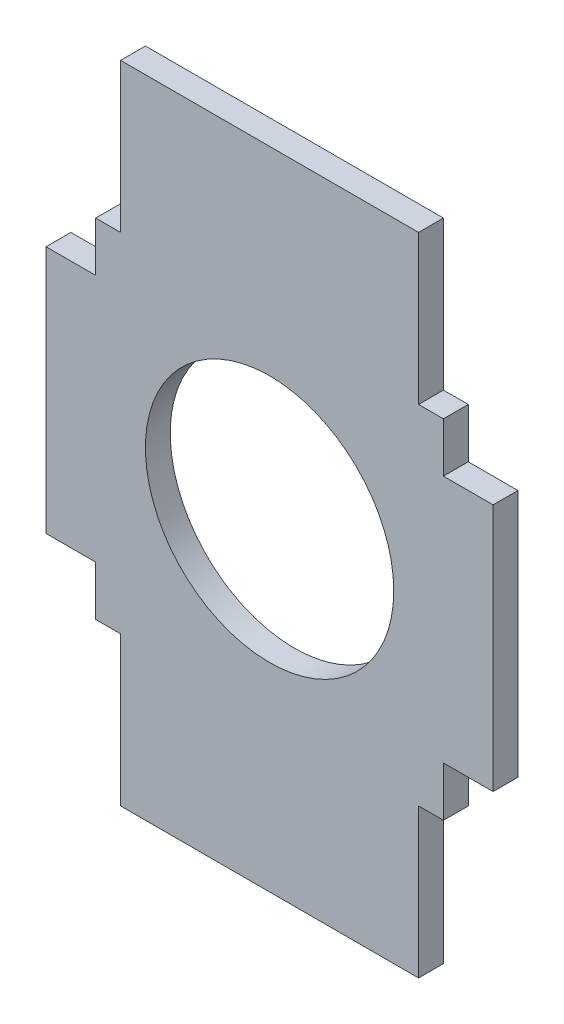
ISO-10303-21;
HEADER;
FILE_DESCRIPTION(('STEP AP214'),'2;1');
FILE_NAME('part.step','',(''),(''),'','','');
FILE_SCHEMA(('AUTOMOTIVE_DESIGN { 1 0 10303 214 1 1 1 1 }'));
ENDSEC;
DATA;
#1=APPLICATION_CONTEXT('core data for automotive mechanical design processes');
#2=APPLICATION_PROTOCOL_DEFINITION('international standard','automotive_design',2000,#1);
#3=PRODUCT_CONTEXT('',#1,'mechanical');
#4=PRODUCT('Part','Part','',(#3));
#5=PRODUCT_RELATED_PRODUCT_CATEGORY('part','',(#4));
#6=PRODUCT_DEFINITION_FORMATION('','',#4);
#7=PRODUCT_DEFINITION_CONTEXT('part definition',#1,'design');
#8=PRODUCT_DEFINITION('design','',#6,#7);
#9=PRODUCT_DEFINITION_SHAPE('','',#8);
#10=(LENGTH_UNIT() NAMED_UNIT(*) SI_UNIT(.MILLI.,.METRE.));
#11=(NAMED_UNIT(*) PLANE_ANGLE_UNIT() SI_UNIT($,.RADIAN.));
#12=(NAMED_UNIT(*) SI_UNIT($,.STERADIAN.) SOLID_ANGLE_UNIT());
#13=UNCERTAINTY_MEASURE_WITH_UNIT(LENGTH_MEASURE(1.E-05),#10,'distance_accuracy_value','');
#14=(GEOMETRIC_REPRESENTATION_CONTEXT(3) GLOBAL_UNCERTAINTY_ASSIGNED_CONTEXT((#13)) GLOBAL_UNIT_ASSIGNED_CONTEXT((#10,
#11,#12)) REPRESENTATION_CONTEXT('',''));
#15=CARTESIAN_POINT('',(0.,0.,0.));
#16=DIRECTION('',(0.,0.,1.));
#17=DIRECTION('',(1.,0.,0.));
#18=AXIS2_PLACEMENT_3D('',#15,#16,#17);
#19=CARTESIAN_POINT('',(-3.73351545858061,352.57227708954,-3.175));
#20=DIRECTION('',(-1.,0.,0.));
#21=DIRECTION('',(0.,0.,1.));
#22=AXIS2_PLACEMENT_3D('',#19,#20,#21);
#23=PLANE('',#22);
#24=DIRECTION('',(0.,-1.,0.));
#25=VECTOR('',#24,1.);
#26=CARTESIAN_POINT('',(-3.73351545858061,352.57227708954,0.));
#27=LINE('',#26,#25);
#28=CARTESIAN_POINT('',(-3.73351545858061,352.57227708954,0.));
#29=VERTEX_POINT('',#28);
#30=CARTESIAN_POINT('',(-3.73351545858061,346.22227708954,0.));
#31=VERTEX_POINT('',#30);
#32=EDGE_CURVE('E202',#29,#31,#27,.T.);
#33=ORIENTED_EDGE('',*,*,#32,.F.);
#34=DIRECTION('',(0.,0.,1.));
#35=VECTOR('',#34,1.);
#36=CARTESIAN_POINT('',(-3.73351545858061,352.57227708954,-3.175));
#37=LINE('',#36,#35);
#38=CARTESIAN_POINT('',(-3.73351545858061,352.57227708954,-3.175));
#39=VERTEX_POINT('',#38);
#40=EDGE_CURVE('E11',#39,#29,#37,.T.);
#41=ORIENTED_EDGE('',*,*,#40,.F.);
#42=DIRECTION('',(0.,-1.,0.));
#43=VECTOR('',#42,1.);
#44=CARTESIAN_POINT('',(-3.73351545858061,352.57227708954,-3.175));
#45=LINE('',#44,#43);
#46=CARTESIAN_POINT('',(-3.73351545858061,346.22227708954,-3.175));
#47=VERTEX_POINT('',#46);
#48=EDGE_CURVE('E259',#39,#47,#45,.T.);
#49=ORIENTED_EDGE('',*,*,#48,.T.);
#50=DIRECTION('',(0.,0.,1.));
#51=VECTOR('',#50,1.);
#52=CARTESIAN_POINT('',(-3.73351545858061,346.22227708954,-3.175));
#53=LINE('',#52,#51);
#54=EDGE_CURVE('E36',#47,#31,#53,.T.);
#55=ORIENTED_EDGE('',*,*,#54,.T.);
#56=EDGE_LOOP('',(#33,#41,#49,#55));
#57=FACE_BOUND('',#56,.T.);
#58=ADVANCED_FACE('F33',(#57),#23,.T.);
#59=CARTESIAN_POINT('',(-0.558515457864788,352.57227708954,-3.175));
#60=DIRECTION('',(0.,1.,0.));
#61=DIRECTION('',(0.,0.,1.));
#62=AXIS2_PLACEMENT_3D('',#59,#60,#61);
#63=PLANE('',#62);
#64=DIRECTION('',(-1.,0.,0.));
#65=VECTOR('',#64,1.);
#66=CARTESIAN_POINT('',(-0.558515457864788,352.57227708954,0.));
#67=LINE('',#66,#65);
#68=CARTESIAN_POINT('',(-0.558515457864788,352.57227708954,0.));
#69=VERTEX_POINT('',#68);
#70=EDGE_CURVE('E257',#69,#29,#67,.T.);
#71=ORIENTED_EDGE('',*,*,#70,.F.);
#72=DIRECTION('',(0.,0.,1.));
#73=VECTOR('',#72,1.);
#74=CARTESIAN_POINT('',(-0.558515457864788,352.57227708954,-3.175));
#75=LINE('',#74,#73);
#76=CARTESIAN_POINT('',(-0.558515457864788,352.57227708954,-3.175));
#77=VERTEX_POINT('',#76);
#78=EDGE_CURVE('E42',#77,#69,#75,.T.);
#79=ORIENTED_EDGE('',*,*,#78,.F.);
#80=DIRECTION('',(-1.,0.,0.));
#81=VECTOR('',#80,1.);
#82=CARTESIAN_POINT('',(-0.558515457864788,352.57227708954,-3.175));
#83=LINE('',#82,#81);
#84=EDGE_CURVE('E192',#77,#39,#83,.T.);
#85=ORIENTED_EDGE('',*,*,#84,.T.);
#86=ORIENTED_EDGE('',*,*,#40,.T.);
#87=EDGE_LOOP('',(#71,#79,#85,#86));
#88=FACE_BOUND('',#87,.T.);
#89=ADVANCED_FACE('F295',(#88),#63,.T.);
#90=CARTESIAN_POINT('',(-0.55851545786479,371.62227708954,-3.175));
#91=DIRECTION('',(-1.,0.,0.));
#92=DIRECTION('',(0.,-1.,0.));
#93=AXIS2_PLACEMENT_3D('',#90,#91,#92);
#94=PLANE('',#93);
#95=DIRECTION('',(0.,-1.,0.));
#96=VECTOR('',#95,1.);
#97=CARTESIAN_POINT('',(-0.55851545786479,371.62227708954,0.));
#98=LINE('',#97,#96);
#99=CARTESIAN_POINT('',(-0.55851545786479,371.62227708954,0.));
#100=VERTEX_POINT('',#99);
#101=EDGE_CURVE('E179',#100,#69,#98,.T.);
#102=ORIENTED_EDGE('',*,*,#101,.F.);
#103=DIRECTION('',(0.,0.,1.));
#104=VECTOR('',#103,1.);
#105=CARTESIAN_POINT('',(-0.55851545786479,371.62227708954,-3.175));
#106=LINE('',#105,#104);
#107=CARTESIAN_POINT('',(-0.55851545786479,371.62227708954,-3.175));
#108=VERTEX_POINT('',#107);
#109=EDGE_CURVE('E174',#108,#100,#106,.T.);
#110=ORIENTED_EDGE('',*,*,#109,.F.);
#111=DIRECTION('',(0.,-1.,0.));
#112=VECTOR('',#111,1.);
#113=CARTESIAN_POINT('',(-0.55851545786479,371.62227708954,-3.175));
#114=LINE('',#113,#112);
#115=EDGE_CURVE('E177',#108,#77,#114,.T.);
#116=ORIENTED_EDGE('',*,*,#115,.T.);
#117=ORIENTED_EDGE('',*,*,#78,.T.);
#118=EDGE_LOOP('',(#102,#110,#116,#117));
#119=FACE_BOUND('',#118,.T.);
#120=ADVANCED_FACE('F176',(#119),#94,.T.);
#121=CARTESIAN_POINT('',(-0.55851545786479,371.62227708954,-3.175));
#122=DIRECTION('',(0.,1.,0.));
#123=DIRECTION('',(0.,0.,1.));
#124=AXIS2_PLACEMENT_3D('',#121,#122,#123);
#125=PLANE('',#124);
#126=DIRECTION('',(-1.,0.,0.));
#127=VECTOR('',#126,1.);
#128=CARTESIAN_POINT('',(-0.55851545786479,371.62227708954,0.));
#129=LINE('',#128,#127);
#130=CARTESIAN_POINT('',(37.5414845421352,371.62227708954,0.));
#131=VERTEX_POINT('',#130);
#132=EDGE_CURVE('E254',#131,#100,#129,.T.);
#133=ORIENTED_EDGE('',*,*,#132,.F.);
#134=DIRECTION('',(0.,0.,1.));
#135=VECTOR('',#134,1.);
#136=CARTESIAN_POINT('',(37.5414845421352,371.62227708954,-3.175));
#137=LINE('',#136,#135);
#138=CARTESIAN_POINT('',(37.5414845421352,371.62227708954,-3.175));
#139=VERTEX_POINT('',#138);
#140=EDGE_CURVE('E184',#139,#131,#137,.T.);
#141=ORIENTED_EDGE('',*,*,#140,.F.);
#142=DIRECTION('',(-1.,0.,0.));
#143=VECTOR('',#142,1.);
#144=CARTESIAN_POINT('',(-0.55851545786479,371.62227708954,-3.175));
#145=LINE('',#144,#143);
#146=EDGE_CURVE('E190',#139,#108,#145,.T.);
#147=ORIENTED_EDGE('',*,*,#146,.T.);
#148=ORIENTED_EDGE('',*,*,#109,.T.);
#149=EDGE_LOOP('',(#133,#141,#147,#148));
#150=FACE_BOUND('',#149,.T.);
#151=ADVANCED_FACE('F194',(#150),#125,.T.);
#152=CARTESIAN_POINT('',(37.5414845421352,371.62227708954,-3.175));
#153=DIRECTION('',(1.,0.,0.));
#154=DIRECTION('',(0.,0.,-1.));
#155=AXIS2_PLACEMENT_3D('',#152,#153,#154);
#156=PLANE('',#155);
#157=DIRECTION('',(0.,1.,0.));
#158=VECTOR('',#157,1.);
#159=CARTESIAN_POINT('',(37.5414845421352,371.62227708954,0.));
#160=LINE('',#159,#158);
#161=CARTESIAN_POINT('',(37.5414845421352,352.57227708954,0.));
#162=VERTEX_POINT('',#161);
#163=EDGE_CURVE('E251',#162,#131,#160,.T.);
#164=ORIENTED_EDGE('',*,*,#163,.F.);
#165=DIRECTION('',(0.,0.,1.));
#166=VECTOR('',#165,1.);
#167=CARTESIAN_POINT('',(37.5414845421352,352.57227708954,-3.175));
#168=LINE('',#167,#166);
#169=CARTESIAN_POINT('',(37.5414845421352,352.57227708954,-3.175));
#170=VERTEX_POINT('',#169);
#171=EDGE_CURVE('E263',#170,#162,#168,.T.);
#172=ORIENTED_EDGE('',*,*,#171,.F.);
#173=DIRECTION('',(0.,1.,0.));
#174=VECTOR('',#173,1.);
#175=CARTESIAN_POINT('',(37.5414845421352,371.62227708954,-3.175));
#176=LINE('',#175,#174);
#177=EDGE_CURVE('E195',#170,#139,#176,.T.);
#178=ORIENTED_EDGE('',*,*,#177,.T.);
#179=ORIENTED_EDGE('',*,*,#140,.T.);
#180=EDGE_LOOP('',(#164,#172,#178,#179));
#181=FACE_BOUND('',#180,.T.);
#182=ADVANCED_FACE('F308',(#181),#156,.T.);
#183=CARTESIAN_POINT('',(37.5414845421352,352.57227708954,-3.175));
#184=DIRECTION('',(0.,1.,0.));
#185=DIRECTION('',(0.,0.,1.));
#186=AXIS2_PLACEMENT_3D('',#183,#184,#185);
#187=PLANE('',#186);
#188=DIRECTION('',(-1.,0.,0.));
#189=VECTOR('',#188,1.);
#190=CARTESIAN_POINT('',(37.5414845421352,352.57227708954,0.));
#191=LINE('',#190,#189);
#192=CARTESIAN_POINT('',(40.7164845407036,352.57227708954,0.));
#193=VERTEX_POINT('',#192);
#194=EDGE_CURVE('E248',#193,#162,#191,.T.);
#195=ORIENTED_EDGE('',*,*,#194,.F.);
#196=DIRECTION('',(0.,0.,1.));
#197=VECTOR('',#196,1.);
#198=CARTESIAN_POINT('',(40.7164845407036,352.57227708954,-3.175));
#199=LINE('',#198,#197);
#200=CARTESIAN_POINT('',(40.7164845407036,352.57227708954,-3.175));
#201=VERTEX_POINT('',#200);
#202=EDGE_CURVE('E265',#201,#193,#199,.T.);
#203=ORIENTED_EDGE('',*,*,#202,.F.);
#204=DIRECTION('',(-1.,0.,0.));
#205=VECTOR('',#204,1.);
#206=CARTESIAN_POINT('',(37.5414845421352,352.57227708954,-3.175));
#207=LINE('',#206,#205);
#208=EDGE_CURVE('E197',#201,#170,#207,.T.);
#209=ORIENTED_EDGE('',*,*,#208,.T.);
#210=ORIENTED_EDGE('',*,*,#171,.T.);
#211=EDGE_LOOP('',(#195,#203,#209,#210));
#212=FACE_BOUND('',#211,.T.);
#213=ADVANCED_FACE('F311',(#212),#187,.T.);
#214=CARTESIAN_POINT('',(40.7164845407036,352.57227708954,-3.175));
#215=DIRECTION('',(1.,0.,0.));
#216=DIRECTION('',(0.,0.,-1.));
#217=AXIS2_PLACEMENT_3D('',#214,#215,#216);
#218=PLANE('',#217);
#219=DIRECTION('',(0.,1.,0.));
#220=VECTOR('',#219,1.);
#221=CARTESIAN_POINT('',(40.7164845407036,352.57227708954,0.));
#222=LINE('',#221,#220);
#223=CARTESIAN_POINT('',(40.7164845407036,346.22227708954,0.));
#224=VERTEX_POINT('',#223);
#225=EDGE_CURVE('E245',#224,#193,#222,.T.);
#226=ORIENTED_EDGE('',*,*,#225,.F.);
#227=DIRECTION('',(0.,0.,1.));
#228=VECTOR('',#227,1.);
#229=CARTESIAN_POINT('',(40.7164845407036,346.22227708954,-3.175));
#230=LINE('',#229,#228);
#231=CARTESIAN_POINT('',(40.7164845407036,346.22227708954,-3.175));
#232=VERTEX_POINT('',#231);
#233=EDGE_CURVE('E267',#232,#224,#230,.T.);
#234=ORIENTED_EDGE('',*,*,#233,.F.);
#235=DIRECTION('',(0.,1.,0.));
#236=VECTOR('',#235,1.);
#237=CARTESIAN_POINT('',(40.7164845407036,352.57227708954,-3.175));
#238=LINE('',#237,#236);
#239=EDGE_CURVE('E430',#232,#201,#238,.T.);
#240=ORIENTED_EDGE('',*,*,#239,.T.);
#241=ORIENTED_EDGE('',*,*,#202,.T.);
#242=EDGE_LOOP('',(#226,#234,#240,#241));
#243=FACE_BOUND('',#242,.T.);
#244=ADVANCED_FACE('F315',(#243),#218,.T.);
#245=CARTESIAN_POINT('',(47.0664845399878,346.22227708954,-3.175));
#246=DIRECTION('',(0.,1.,0.));
#247=DIRECTION('',(0.,0.,1.));
#248=AXIS2_PLACEMENT_3D('',#245,#246,#247);
#249=PLANE('',#248);
#250=DIRECTION('',(-1.,0.,0.));
#251=VECTOR('',#250,1.);
#252=CARTESIAN_POINT('',(47.0664845399878,346.22227708954,0.));
#253=LINE('',#252,#251);
#254=CARTESIAN_POINT('',(47.0664845399878,346.22227708954,0.));
#255=VERTEX_POINT('',#254);
#256=EDGE_CURVE('E242',#255,#224,#253,.T.);
#257=ORIENTED_EDGE('',*,*,#256,.F.);
#258=DIRECTION('',(0.,0.,1.));
#259=VECTOR('',#258,1.);
#260=CARTESIAN_POINT('',(47.0664845399878,346.22227708954,-3.175));
#261=LINE('',#260,#259);
#262=CARTESIAN_POINT('',(47.0664845399878,346.22227708954,-3.175));
#263=VERTEX_POINT('',#262);
#264=EDGE_CURVE('E269',#263,#255,#261,.T.);
#265=ORIENTED_EDGE('',*,*,#264,.F.);
#266=DIRECTION('',(-1.,0.,0.));
#267=VECTOR('',#266,1.);
#268=CARTESIAN_POINT('',(47.0664845399878,346.22227708954,-3.175));
#269=LINE('',#268,#267);
#270=EDGE_CURVE('E427',#263,#232,#269,.T.);
#271=ORIENTED_EDGE('',*,*,#270,.T.);
#272=ORIENTED_EDGE('',*,*,#233,.T.);
#273=EDGE_LOOP('',(#257,#265,#271,#272));
#274=FACE_BOUND('',#273,.T.);
#275=ADVANCED_FACE('F319',(#274),#249,.T.);
#276=CARTESIAN_POINT('',(47.0664845399878,346.22227708954,-3.175));
#277=DIRECTION('',(1.,0.,0.));
#278=DIRECTION('',(0.,0.,-1.));
#279=AXIS2_PLACEMENT_3D('',#276,#277,#278);
#280=PLANE('',#279);
#281=DIRECTION('',(0.,1.,0.));
#282=VECTOR('',#281,1.);
#283=CARTESIAN_POINT('',(47.0664845399878,346.22227708954,0.));
#284=LINE('',#283,#282);
#285=CARTESIAN_POINT('',(47.0664845399878,314.47227708954,0.));
#286=VERTEX_POINT('',#285);
#287=EDGE_CURVE('E239',#286,#255,#284,.T.);
#288=ORIENTED_EDGE('',*,*,#287,.F.);
#289=DIRECTION('',(0.,0.,1.));
#290=VECTOR('',#289,1.);
#291=CARTESIAN_POINT('',(47.0664845399878,314.47227708954,-3.175));
#292=LINE('',#291,#290);
#293=CARTESIAN_POINT('',(47.0664845399878,314.47227708954,-3.175));
#294=VERTEX_POINT('',#293);
#295=EDGE_CURVE('E271',#294,#286,#292,.T.);
#296=ORIENTED_EDGE('',*,*,#295,.F.);
#297=DIRECTION('',(0.,1.,0.));
#298=VECTOR('',#297,1.);
#299=CARTESIAN_POINT('',(47.0664845399878,346.22227708954,-3.175));
#300=LINE('',#299,#298);
#301=EDGE_CURVE('E424',#294,#263,#300,.T.);
#302=ORIENTED_EDGE('',*,*,#301,.T.);
#303=ORIENTED_EDGE('',*,*,#264,.T.);
#304=EDGE_LOOP('',(#288,#296,#302,#303));
#305=FACE_BOUND('',#304,.T.);
#306=ADVANCED_FACE('F323',(#305),#280,.T.);
#307=CARTESIAN_POINT('',(47.0664845399878,314.47227708954,-3.175));
#308=DIRECTION('',(0.,-1.,0.));
#309=DIRECTION('',(0.,0.,-1.));
#310=AXIS2_PLACEMENT_3D('',#307,#308,#309);
#311=PLANE('',#310);
#312=DIRECTION('',(1.,0.,0.));
#313=VECTOR('',#312,1.);
#314=CARTESIAN_POINT('',(47.0664845399878,314.47227708954,0.));
#315=LINE('',#314,#313);
#316=CARTESIAN_POINT('',(40.7164845407036,314.47227708954,0.));
#317=VERTEX_POINT('',#316);
#318=EDGE_CURVE('E236',#317,#286,#315,.T.);
#319=ORIENTED_EDGE('',*,*,#318,.F.);
#320=DIRECTION('',(0.,0.,1.));
#321=VECTOR('',#320,1.);
#322=CARTESIAN_POINT('',(40.7164845407036,314.47227708954,-3.175));
#323=LINE('',#322,#321);
#324=CARTESIAN_POINT('',(40.7164845407036,314.47227708954,-3.175));
#325=VERTEX_POINT('',#324);
#326=EDGE_CURVE('E273',#325,#317,#323,.T.);
#327=ORIENTED_EDGE('',*,*,#326,.F.);
#328=DIRECTION('',(1.,0.,0.));
#329=VECTOR('',#328,1.);
#330=CARTESIAN_POINT('',(47.0664845399878,314.47227708954,-3.175));
#331=LINE('',#330,#329);
#332=EDGE_CURVE('E421',#325,#294,#331,.T.);
#333=ORIENTED_EDGE('',*,*,#332,.T.);
#334=ORIENTED_EDGE('',*,*,#295,.T.);
#335=EDGE_LOOP('',(#319,#327,#333,#334));
#336=FACE_BOUND('',#335,.T.);
#337=ADVANCED_FACE('F327',(#336),#311,.T.);
#338=CARTESIAN_POINT('',(40.7164845407036,308.12227708954,-3.175));
#339=DIRECTION('',(1.,0.,0.));
#340=DIRECTION('',(0.,0.,-1.));
#341=AXIS2_PLACEMENT_3D('',#338,#339,#340);
#342=PLANE('',#341);
#343=DIRECTION('',(0.,1.,0.));
#344=VECTOR('',#343,1.);
#345=CARTESIAN_POINT('',(40.7164845407036,308.12227708954,0.));
#346=LINE('',#345,#344);
#347=CARTESIAN_POINT('',(40.7164845407036,308.12227708954,0.));
#348=VERTEX_POINT('',#347);
#349=EDGE_CURVE('E233',#348,#317,#346,.T.);
#350=ORIENTED_EDGE('',*,*,#349,.F.);
#351=DIRECTION('',(0.,0.,1.));
#352=VECTOR('',#351,1.);
#353=CARTESIAN_POINT('',(40.7164845407036,308.12227708954,-3.175));
#354=LINE('',#353,#352);
#355=CARTESIAN_POINT('',(40.7164845407036,308.12227708954,-3.175));
#356=VERTEX_POINT('',#355);
#357=EDGE_CURVE('E275',#356,#348,#354,.T.);
#358=ORIENTED_EDGE('',*,*,#357,.F.);
#359=DIRECTION('',(0.,1.,0.));
#360=VECTOR('',#359,1.);
#361=CARTESIAN_POINT('',(40.7164845407036,308.12227708954,-3.175));
#362=LINE('',#361,#360);
#363=EDGE_CURVE('E418',#356,#325,#362,.T.);
#364=ORIENTED_EDGE('',*,*,#363,.T.);
#365=ORIENTED_EDGE('',*,*,#326,.T.);
#366=EDGE_LOOP('',(#350,#358,#364,#365));
#367=FACE_BOUND('',#366,.T.);
#368=ADVANCED_FACE('F331',(#367),#342,.T.);
#369=CARTESIAN_POINT('',(37.5414845421352,308.12227708954,-3.175));
#370=DIRECTION('',(0.,-1.,0.));
#371=DIRECTION('',(0.,0.,-1.));
#372=AXIS2_PLACEMENT_3D('',#369,#370,#371);
#373=PLANE('',#372);
#374=DIRECTION('',(1.,0.,0.));
#375=VECTOR('',#374,1.);
#376=CARTESIAN_POINT('',(37.5414845421352,308.12227708954,0.));
#377=LINE('',#376,#375);
#378=CARTESIAN_POINT('',(37.5414845421352,308.12227708954,0.));
#379=VERTEX_POINT('',#378);
#380=EDGE_CURVE('E230',#379,#348,#377,.T.);
#381=ORIENTED_EDGE('',*,*,#380,.F.);
#382=DIRECTION('',(0.,0.,1.));
#383=VECTOR('',#382,1.);
#384=CARTESIAN_POINT('',(37.5414845421352,308.12227708954,-3.175));
#385=LINE('',#384,#383);
#386=CARTESIAN_POINT('',(37.5414845421352,308.12227708954,-3.175));
#387=VERTEX_POINT('',#386);
#388=EDGE_CURVE('E277',#387,#379,#385,.T.);
#389=ORIENTED_EDGE('',*,*,#388,.F.);
#390=DIRECTION('',(1.,0.,0.));
#391=VECTOR('',#390,1.);
#392=CARTESIAN_POINT('',(37.5414845421352,308.12227708954,-3.175));
#393=LINE('',#392,#391);
#394=EDGE_CURVE('E415',#387,#356,#393,.T.);
#395=ORIENTED_EDGE('',*,*,#394,.T.);
#396=ORIENTED_EDGE('',*,*,#357,.T.);
#397=EDGE_LOOP('',(#381,#389,#395,#396));
#398=FACE_BOUND('',#397,.T.);
#399=ADVANCED_FACE('F335',(#398),#373,.T.);
#400=CARTESIAN_POINT('',(37.5414845421352,289.07227708954,-3.175));
#401=DIRECTION('',(1.,0.,0.));
#402=DIRECTION('',(0.,0.,-1.));
#403=AXIS2_PLACEMENT_3D('',#400,#401,#402);
#404=PLANE('',#403);
#405=DIRECTION('',(0.,1.,0.));
#406=VECTOR('',#405,1.);
#407=CARTESIAN_POINT('',(37.5414845421352,289.07227708954,0.));
#408=LINE('',#407,#406);
#409=CARTESIAN_POINT('',(37.5414845421352,289.07227708954,0.));
#410=VERTEX_POINT('',#409);
#411=EDGE_CURVE('E227',#410,#379,#408,.T.);
#412=ORIENTED_EDGE('',*,*,#411,.F.);
#413=DIRECTION('',(0.,0.,1.));
#414=VECTOR('',#413,1.);
#415=CARTESIAN_POINT('',(37.5414845421352,289.07227708954,-3.175));
#416=LINE('',#415,#414);
#417=CARTESIAN_POINT('',(37.5414845421352,289.07227708954,-3.175));
#418=VERTEX_POINT('',#417);
#419=EDGE_CURVE('E279',#418,#410,#416,.T.);
#420=ORIENTED_EDGE('',*,*,#419,.F.);
#421=DIRECTION('',(0.,1.,0.));
#422=VECTOR('',#421,1.);
#423=CARTESIAN_POINT('',(37.5414845421352,289.07227708954,-3.175));
#424=LINE('',#423,#422);
#425=EDGE_CURVE('E412',#418,#387,#424,.T.);
#426=ORIENTED_EDGE('',*,*,#425,.T.);
#427=ORIENTED_EDGE('',*,*,#388,.T.);
#428=EDGE_LOOP('',(#412,#420,#426,#427));
#429=FACE_BOUND('',#428,.T.);
#430=ADVANCED_FACE('F339',(#429),#404,.T.);
#431=CARTESIAN_POINT('',(-0.55851545786479,289.07227708954,-3.175));
#432=DIRECTION('',(0.,-1.,0.));
#433=DIRECTION('',(0.,0.,-1.));
#434=AXIS2_PLACEMENT_3D('',#431,#432,#433);
#435=PLANE('',#434);
#436=DIRECTION('',(1.,0.,0.));
#437=VECTOR('',#436,1.);
#438=CARTESIAN_POINT('',(-0.55851545786479,289.07227708954,0.));
#439=LINE('',#438,#437);
#440=CARTESIAN_POINT('',(-0.55851545786479,289.07227708954,0.));
#441=VERTEX_POINT('',#440);
#442=EDGE_CURVE('E224',#441,#410,#439,.T.);
#443=ORIENTED_EDGE('',*,*,#442,.F.);
#444=DIRECTION('',(0.,0.,1.));
#445=VECTOR('',#444,1.);
#446=CARTESIAN_POINT('',(-0.55851545786479,289.07227708954,-3.175));
#447=LINE('',#446,#445);
#448=CARTESIAN_POINT('',(-0.55851545786479,289.07227708954,-3.175));
#449=VERTEX_POINT('',#448);
#450=EDGE_CURVE('E281',#449,#441,#447,.T.);
#451=ORIENTED_EDGE('',*,*,#450,.F.);
#452=DIRECTION('',(1.,0.,0.));
#453=VECTOR('',#452,1.);
#454=CARTESIAN_POINT('',(-0.55851545786479,289.07227708954,-3.175));
#455=LINE('',#454,#453);
#456=EDGE_CURVE('E409',#449,#418,#455,.T.);
#457=ORIENTED_EDGE('',*,*,#456,.T.);
#458=ORIENTED_EDGE('',*,*,#419,.T.);
#459=EDGE_LOOP('',(#443,#451,#457,#458));
#460=FACE_BOUND('',#459,.T.);
#461=ADVANCED_FACE('F343',(#460),#435,.T.);
#462=CARTESIAN_POINT('',(-0.55851545786479,289.07227708954,-3.175));
#463=DIRECTION('',(-1.,0.,0.));
#464=DIRECTION('',(0.,-1.,0.));
#465=AXIS2_PLACEMENT_3D('',#462,#463,#464);
#466=PLANE('',#465);
#467=DIRECTION('',(0.,-1.,0.));
#468=VECTOR('',#467,1.);
#469=CARTESIAN_POINT('',(-0.55851545786479,289.07227708954,0.));
#470=LINE('',#469,#468);
#471=CARTESIAN_POINT('',(-0.55851545786478,308.12227708954,0.));
#472=VERTEX_POINT('',#471);
#473=EDGE_CURVE('E221',#472,#441,#470,.T.);
#474=ORIENTED_EDGE('',*,*,#473,.F.);
#475=DIRECTION('',(0.,0.,1.));
#476=VECTOR('',#475,1.);
#477=CARTESIAN_POINT('',(-0.55851545786478,308.12227708954,-3.175));
#478=LINE('',#477,#476);
#479=CARTESIAN_POINT('',(-0.55851545786478,308.12227708954,-3.175));
#480=VERTEX_POINT('',#479);
#481=EDGE_CURVE('E283',#480,#472,#478,.T.);
#482=ORIENTED_EDGE('',*,*,#481,.F.);
#483=DIRECTION('',(0.,-1.,0.));
#484=VECTOR('',#483,1.);
#485=CARTESIAN_POINT('',(-0.55851545786479,289.07227708954,-3.175));
#486=LINE('',#485,#484);
#487=EDGE_CURVE('E406',#480,#449,#486,.T.);
#488=ORIENTED_EDGE('',*,*,#487,.T.);
#489=ORIENTED_EDGE('',*,*,#450,.T.);
#490=EDGE_LOOP('',(#474,#482,#488,#489));
#491=FACE_BOUND('',#490,.T.);
#492=ADVANCED_FACE('F347',(#491),#466,.T.);
#493=CARTESIAN_POINT('',(-0.55851545786478,308.12227708954,-3.175));
#494=DIRECTION('',(0.,-1.,0.));
#495=DIRECTION('',(0.,0.,-1.));
#496=AXIS2_PLACEMENT_3D('',#493,#494,#495);
#497=PLANE('',#496);
#498=DIRECTION('',(1.,0.,0.));
#499=VECTOR('',#498,1.);
#500=CARTESIAN_POINT('',(-0.55851545786478,308.12227708954,0.));
#501=LINE('',#500,#499);
#502=CARTESIAN_POINT('',(-3.73351545858061,308.12227708954,0.));
#503=VERTEX_POINT('',#502);
#504=EDGE_CURVE('E218',#503,#472,#501,.T.);
#505=ORIENTED_EDGE('',*,*,#504,.F.);
#506=DIRECTION('',(0.,0.,1.));
#507=VECTOR('',#506,1.);
#508=CARTESIAN_POINT('',(-3.73351545858061,308.12227708954,-3.175));
#509=LINE('',#508,#507);
#510=CARTESIAN_POINT('',(-3.73351545858061,308.12227708954,-3.175));
#511=VERTEX_POINT('',#510);
#512=EDGE_CURVE('E285',#511,#503,#509,.T.);
#513=ORIENTED_EDGE('',*,*,#512,.F.);
#514=DIRECTION('',(1.,0.,0.));
#515=VECTOR('',#514,1.);
#516=CARTESIAN_POINT('',(-0.55851545786478,308.12227708954,-3.175));
#517=LINE('',#516,#515);
#518=EDGE_CURVE('E403',#511,#480,#517,.T.);
#519=ORIENTED_EDGE('',*,*,#518,.T.);
#520=ORIENTED_EDGE('',*,*,#481,.T.);
#521=EDGE_LOOP('',(#505,#513,#519,#520));
#522=FACE_BOUND('',#521,.T.);
#523=ADVANCED_FACE('F351',(#522),#497,.T.);
#524=CARTESIAN_POINT('',(-3.73351545858061,308.12227708954,-3.175));
#525=DIRECTION('',(-1.,0.,0.));
#526=DIRECTION('',(0.,0.,1.));
#527=AXIS2_PLACEMENT_3D('',#524,#525,#526);
#528=PLANE('',#527);
#529=DIRECTION('',(0.,-1.,0.));
#530=VECTOR('',#529,1.);
#531=CARTESIAN_POINT('',(-3.73351545858061,308.12227708954,0.));
#532=LINE('',#531,#530);
#533=CARTESIAN_POINT('',(-3.73351545858061,314.47227708954,0.));
#534=VERTEX_POINT('',#533);
#535=EDGE_CURVE('E215',#534,#503,#532,.T.);
#536=ORIENTED_EDGE('',*,*,#535,.F.);
#537=DIRECTION('',(0.,0.,1.));
#538=VECTOR('',#537,1.);
#539=CARTESIAN_POINT('',(-3.73351545858061,314.47227708954,-3.175));
#540=LINE('',#539,#538);
#541=CARTESIAN_POINT('',(-3.73351545858061,314.47227708954,-3.175));
#542=VERTEX_POINT('',#541);
#543=EDGE_CURVE('E287',#542,#534,#540,.T.);
#544=ORIENTED_EDGE('',*,*,#543,.F.);
#545=DIRECTION('',(0.,-1.,0.));
#546=VECTOR('',#545,1.);
#547=CARTESIAN_POINT('',(-3.73351545858061,308.12227708954,-3.175));
#548=LINE('',#547,#546);
#549=EDGE_CURVE('E400',#542,#511,#548,.T.);
#550=ORIENTED_EDGE('',*,*,#549,.T.);
#551=ORIENTED_EDGE('',*,*,#512,.T.);
#552=EDGE_LOOP('',(#536,#544,#550,#551));
#553=FACE_BOUND('',#552,.T.);
#554=ADVANCED_FACE('F355',(#553),#528,.T.);
#555=CARTESIAN_POINT('',(-10.0835154578648,314.47227708954,-3.175));
#556=DIRECTION('',(0.,-1.,0.));
#557=DIRECTION('',(0.,0.,-1.));
#558=AXIS2_PLACEMENT_3D('',#555,#556,#557);
#559=PLANE('',#558);
#560=DIRECTION('',(1.,0.,0.));
#561=VECTOR('',#560,1.);
#562=CARTESIAN_POINT('',(-10.0835154578648,314.47227708954,0.));
#563=LINE('',#562,#561);
#564=CARTESIAN_POINT('',(-10.0835154578648,314.47227708954,0.));
#565=VERTEX_POINT('',#564);
#566=EDGE_CURVE('E212',#565,#534,#563,.T.);
#567=ORIENTED_EDGE('',*,*,#566,.F.);
#568=DIRECTION('',(0.,0.,1.));
#569=VECTOR('',#568,1.);
#570=CARTESIAN_POINT('',(-10.0835154578648,314.47227708954,-3.175));
#571=LINE('',#570,#569);
#572=CARTESIAN_POINT('',(-10.0835154578648,314.47227708954,-3.175));
#573=VERTEX_POINT('',#572);
#574=EDGE_CURVE('E289',#573,#565,#571,.T.);
#575=ORIENTED_EDGE('',*,*,#574,.F.);
#576=DIRECTION('',(1.,0.,0.));
#577=VECTOR('',#576,1.);
#578=CARTESIAN_POINT('',(-10.0835154578648,314.47227708954,-3.175));
#579=LINE('',#578,#577);
#580=EDGE_CURVE('E397',#573,#542,#579,.T.);
#581=ORIENTED_EDGE('',*,*,#580,.T.);
#582=ORIENTED_EDGE('',*,*,#543,.T.);
#583=EDGE_LOOP('',(#567,#575,#581,#582));
#584=FACE_BOUND('',#583,.T.);
#585=ADVANCED_FACE('F359',(#584),#559,.T.);
#586=CARTESIAN_POINT('',(-10.0835154578648,346.22227708954,-3.175));
#587=DIRECTION('',(-1.,0.,0.));
#588=DIRECTION('',(0.,-1.,0.));
#589=AXIS2_PLACEMENT_3D('',#586,#587,#588);
#590=PLANE('',#589);
#591=DIRECTION('',(0.,-1.,0.));
#592=VECTOR('',#591,1.);
#593=CARTESIAN_POINT('',(-10.0835154578648,346.22227708954,0.));
#594=LINE('',#593,#592);
#595=CARTESIAN_POINT('',(-10.0835154578648,346.22227708954,0.));
#596=VERTEX_POINT('',#595);
#597=EDGE_CURVE('E209',#596,#565,#594,.T.);
#598=ORIENTED_EDGE('',*,*,#597,.F.);
#599=DIRECTION('',(0.,0.,1.));
#600=VECTOR('',#599,1.);
#601=CARTESIAN_POINT('',(-10.0835154578648,346.22227708954,-3.175));
#602=LINE('',#601,#600);
#603=CARTESIAN_POINT('',(-10.0835154578648,346.22227708954,-3.175));
#604=VERTEX_POINT('',#603);
#605=EDGE_CURVE('E290',#604,#596,#602,.T.);
#606=ORIENTED_EDGE('',*,*,#605,.F.);
#607=DIRECTION('',(0.,-1.,0.));
#608=VECTOR('',#607,1.);
#609=CARTESIAN_POINT('',(-10.0835154578648,346.22227708954,-3.175));
#610=LINE('',#609,#608);
#611=EDGE_CURVE('E394',#604,#573,#610,.T.);
#612=ORIENTED_EDGE('',*,*,#611,.T.);
#613=ORIENTED_EDGE('',*,*,#574,.T.);
#614=EDGE_LOOP('',(#598,#606,#612,#613));
#615=FACE_BOUND('',#614,.T.);
#616=ADVANCED_FACE('F363',(#615),#590,.T.);
#617=CARTESIAN_POINT('',(-10.0835154578648,346.22227708954,-3.175));
#618=DIRECTION('',(0.,1.,0.));
#619=DIRECTION('',(0.,0.,1.));
#620=AXIS2_PLACEMENT_3D('',#617,#618,#619);
#621=PLANE('',#620);
#622=DIRECTION('',(-1.,0.,0.));
#623=VECTOR('',#622,1.);
#624=CARTESIAN_POINT('',(-10.0835154578648,346.22227708954,0.));
#625=LINE('',#624,#623);
#626=EDGE_CURVE('E205',#31,#596,#625,.T.);
#627=ORIENTED_EDGE('',*,*,#626,.F.);
#628=ORIENTED_EDGE('',*,*,#54,.F.);
#629=DIRECTION('',(-1.,0.,0.));
#630=VECTOR('',#629,1.);
#631=CARTESIAN_POINT('',(-10.0835154578648,346.22227708954,-3.175));
#632=LINE('',#631,#630);
#633=EDGE_CURVE('E392',#47,#604,#632,.T.);
#634=ORIENTED_EDGE('',*,*,#633,.T.);
#635=ORIENTED_EDGE('',*,*,#605,.T.);
#636=EDGE_LOOP('',(#627,#628,#634,#635));
#637=FACE_BOUND('',#636,.T.);
#638=ADVANCED_FACE('F292',(#637),#621,.T.);
#639=CARTESIAN_POINT('',(0.,0.,-3.175));
#640=DIRECTION('',(0.,0.,1.));
#641=DIRECTION('',(1.,0.,0.));
#642=AXIS2_PLACEMENT_3D('',#639,#640,#641);
#643=PLANE('',#642);
#644=CARTESIAN_POINT('',(18.4914845421352,330.34727708954,-3.175));
#645=DIRECTION('',(0.,0.,1.));
#646=DIRECTION('',(1.,0.,0.));
#647=AXIS2_PLACEMENT_3D('',#644,#645,#646);
#648=CIRCLE('',#647,15.875);
#649=CARTESIAN_POINT('',(34.3664845421352,330.34727708954,-3.175));
#650=VERTEX_POINT('',#649);
#651=EDGE_CURVE('E206',#650,#650,#648,.T.);
#652=ORIENTED_EDGE('',*,*,#651,.T.);
#653=EDGE_LOOP('',(#652));
#654=FACE_BOUND('',#653,.T.);
#655=ORIENTED_EDGE('',*,*,#48,.F.);
#656=ORIENTED_EDGE('',*,*,#84,.F.);
#657=ORIENTED_EDGE('',*,*,#115,.F.);
#658=ORIENTED_EDGE('',*,*,#146,.F.);
#659=ORIENTED_EDGE('',*,*,#177,.F.);
#660=ORIENTED_EDGE('',*,*,#208,.F.);
#661=ORIENTED_EDGE('',*,*,#239,.F.);
#662=ORIENTED_EDGE('',*,*,#270,.F.);
#663=ORIENTED_EDGE('',*,*,#301,.F.);
#664=ORIENTED_EDGE('',*,*,#332,.F.);
#665=ORIENTED_EDGE('',*,*,#363,.F.);
#666=ORIENTED_EDGE('',*,*,#394,.F.);
#667=ORIENTED_EDGE('',*,*,#425,.F.);
#668=ORIENTED_EDGE('',*,*,#456,.F.);
#669=ORIENTED_EDGE('',*,*,#487,.F.);
#670=ORIENTED_EDGE('',*,*,#518,.F.);
#671=ORIENTED_EDGE('',*,*,#549,.F.);
#672=ORIENTED_EDGE('',*,*,#580,.F.);
#673=ORIENTED_EDGE('',*,*,#611,.F.);
#674=ORIENTED_EDGE('',*,*,#633,.F.);
#675=EDGE_LOOP('',(#655,#656,#657,#658,#659,#660,#661,#662,#663,#664,#665,#666,#667,#668,#669,
#670,#671,#672,#673,#674));
#676=FACE_BOUND('',#675,.T.);
#677=ADVANCED_FACE('F188',(#654,#676),#643,.F.);
#678=CARTESIAN_POINT('',(0.,0.,0.));
#679=DIRECTION('',(0.,0.,1.));
#680=DIRECTION('',(1.,0.,0.));
#681=AXIS2_PLACEMENT_3D('',#678,#679,#680);
#682=PLANE('',#681);
#683=CARTESIAN_POINT('',(18.4914845421352,330.34727708954,0.));
#684=DIRECTION('',(0.,0.,1.));
#685=DIRECTION('',(1.,0.,0.));
#686=AXIS2_PLACEMENT_3D('',#683,#684,#685);
#687=CIRCLE('',#686,15.875);
#688=CARTESIAN_POINT('',(34.3664845421352,330.34727708954,0.));
#689=VERTEX_POINT('',#688);
#690=EDGE_CURVE('E387',#689,#689,#687,.T.);
#691=ORIENTED_EDGE('',*,*,#690,.F.);
#692=EDGE_LOOP('',(#691));
#693=FACE_BOUND('',#692,.T.);
#694=ORIENTED_EDGE('',*,*,#32,.T.);
#695=ORIENTED_EDGE('',*,*,#626,.T.);
#696=ORIENTED_EDGE('',*,*,#597,.T.);
#697=ORIENTED_EDGE('',*,*,#566,.T.);
#698=ORIENTED_EDGE('',*,*,#535,.T.);
#699=ORIENTED_EDGE('',*,*,#504,.T.);
#700=ORIENTED_EDGE('',*,*,#473,.T.);
#701=ORIENTED_EDGE('',*,*,#442,.T.);
#702=ORIENTED_EDGE('',*,*,#411,.T.);
#703=ORIENTED_EDGE('',*,*,#380,.T.);
#704=ORIENTED_EDGE('',*,*,#349,.T.);
#705=ORIENTED_EDGE('',*,*,#318,.T.);
#706=ORIENTED_EDGE('',*,*,#287,.T.);
#707=ORIENTED_EDGE('',*,*,#256,.T.);
#708=ORIENTED_EDGE('',*,*,#225,.T.);
#709=ORIENTED_EDGE('',*,*,#194,.T.);
#710=ORIENTED_EDGE('',*,*,#163,.T.);
#711=ORIENTED_EDGE('',*,*,#132,.T.);
#712=ORIENTED_EDGE('',*,*,#101,.T.);
#713=ORIENTED_EDGE('',*,*,#70,.T.);
#714=EDGE_LOOP('',(#694,#695,#696,#697,#698,#699,#700,#701,#702,#703,#704,#705,#706,#707,#708,
#709,#710,#711,#712,#713));
#715=FACE_BOUND('',#714,.T.);
#716=ADVANCED_FACE('F294',(#693,#715),#682,.T.);
#717=CARTESIAN_POINT('',(18.4914845421352,330.34727708954,-3.175));
#718=DIRECTION('',(0.,0.,1.));
#719=DIRECTION('',(1.,0.,0.));
#720=AXIS2_PLACEMENT_3D('',#717,#718,#719);
#721=CYLINDRICAL_SURFACE('',#720,15.875);
#722=ORIENTED_EDGE('',*,*,#651,.F.);
#723=EDGE_LOOP('',(#722));
#724=FACE_BOUND('',#723,.T.);
#725=ORIENTED_EDGE('',*,*,#690,.T.);
#726=EDGE_LOOP('',(#725));
#727=FACE_BOUND('',#726,.T.);
#728=ADVANCED_FACE('F375',(#724,#727),#721,.F.);
#729=CLOSED_SHELL('',(#58,#89,#120,#151,#182,#213,#244,#275,#306,#337,#368,#399,#430,#461,#492,
#523,#554,#585,#616,#638,#677,#716,#728));
#730=MANIFOLD_SOLID_BREP('B2',#729);
#731=ADVANCED_BREP_SHAPE_REPRESENTATION('',(#18,#730),#14);
#732=SHAPE_DEFINITION_REPRESENTATION(#9,#731);
ENDSEC;
END-ISO-10303-21;
